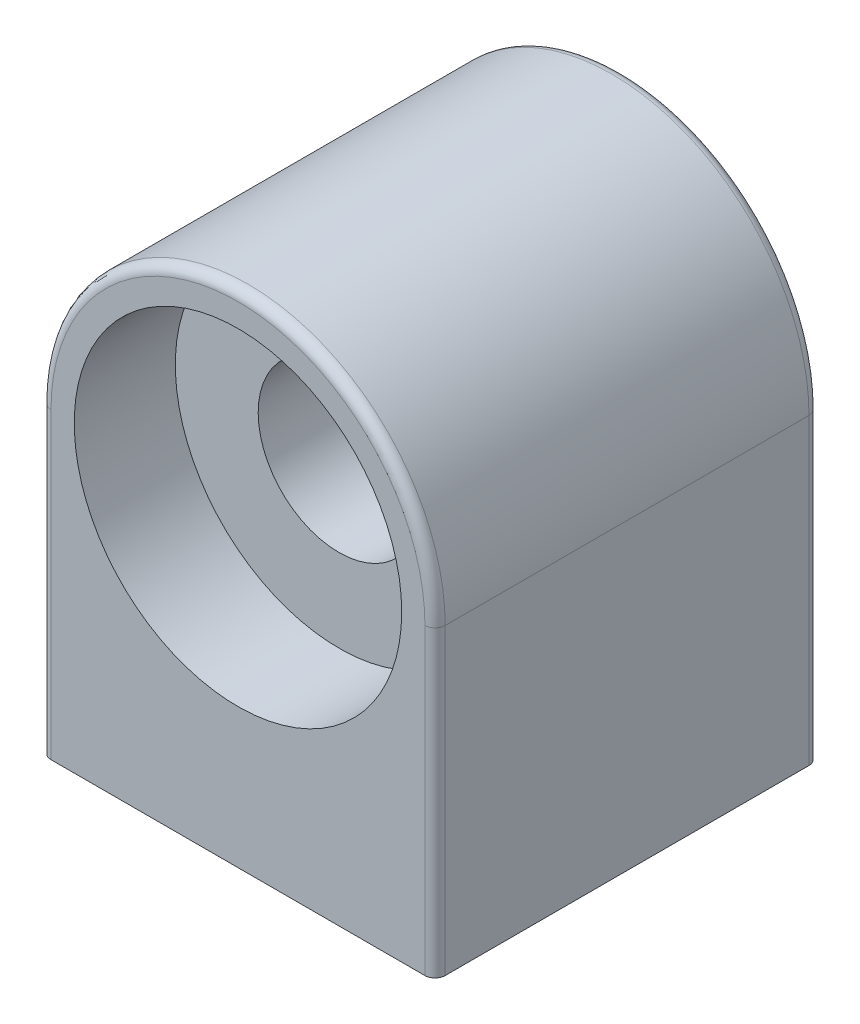
ISO-10303-21;
HEADER;
FILE_DESCRIPTION(('STEP AP214'),'2;1');
FILE_NAME('part.step','',(''),(''),'','','');
FILE_SCHEMA(('AUTOMOTIVE_DESIGN { 1 0 10303 214 1 1 1 1 }'));
ENDSEC;
DATA;
#1=APPLICATION_CONTEXT('core data for automotive mechanical design processes');
#2=APPLICATION_PROTOCOL_DEFINITION('international standard','automotive_design',2000,#1);
#3=PRODUCT_CONTEXT('',#1,'mechanical');
#4=PRODUCT('Part','Part','',(#3));
#5=PRODUCT_RELATED_PRODUCT_CATEGORY('part','',(#4));
#6=PRODUCT_DEFINITION_FORMATION('','',#4);
#7=PRODUCT_DEFINITION_CONTEXT('part definition',#1,'design');
#8=PRODUCT_DEFINITION('design','',#6,#7);
#9=PRODUCT_DEFINITION_SHAPE('','',#8);
#10=(LENGTH_UNIT() NAMED_UNIT(*) SI_UNIT(.MILLI.,.METRE.));
#11=(NAMED_UNIT(*) PLANE_ANGLE_UNIT() SI_UNIT($,.RADIAN.));
#12=(NAMED_UNIT(*) SI_UNIT($,.STERADIAN.) SOLID_ANGLE_UNIT());
#13=UNCERTAINTY_MEASURE_WITH_UNIT(LENGTH_MEASURE(1.E-05),#10,'distance_accuracy_value','');
#14=(GEOMETRIC_REPRESENTATION_CONTEXT(3) GLOBAL_UNCERTAINTY_ASSIGNED_CONTEXT((#13)) GLOBAL_UNIT_ASSIGNED_CONTEXT((#10,
#11,#12)) REPRESENTATION_CONTEXT('',''));
#15=CARTESIAN_POINT('',(0.,0.,0.));
#16=DIRECTION('',(0.,0.,1.));
#17=DIRECTION('',(1.,0.,0.));
#18=AXIS2_PLACEMENT_3D('',#15,#16,#17);
#19=CARTESIAN_POINT('',(0.,0.,9.5));
#20=DIRECTION('',(0.,0.,-1.));
#21=DIRECTION('',(-1.,0.,0.));
#22=AXIS2_PLACEMENT_3D('',#19,#20,#21);
#23=CYLINDRICAL_SURFACE('',#22,4.);
#24=CARTESIAN_POINT('',(0.,0.,-4.5));
#25=DIRECTION('',(0.,0.,-1.));
#26=DIRECTION('',(-1.,0.,0.));
#27=AXIS2_PLACEMENT_3D('',#24,#25,#26);
#28=CIRCLE('',#27,4.);
#29=CARTESIAN_POINT('',(-4.,0.,-4.5));
#30=VERTEX_POINT('',#29);
#31=EDGE_CURVE('E164',#30,#30,#28,.F.);
#32=ORIENTED_EDGE('',*,*,#31,.F.);
#33=EDGE_LOOP('',(#32));
#34=FACE_BOUND('',#33,.T.);
#35=CARTESIAN_POINT('',(0.,0.,4.5));
#36=DIRECTION('',(0.,0.,1.));
#37=DIRECTION('',(1.,0.,0.));
#38=AXIS2_PLACEMENT_3D('',#35,#36,#37);
#39=CIRCLE('',#38,4.);
#40=CARTESIAN_POINT('',(4.,0.,4.5));
#41=VERTEX_POINT('',#40);
#42=EDGE_CURVE('E159',#41,#41,#39,.F.);
#43=ORIENTED_EDGE('',*,*,#42,.F.);
#44=EDGE_LOOP('',(#43));
#45=FACE_BOUND('',#44,.T.);
#46=ADVANCED_FACE('F35',(#34,#45),#23,.F.);
#47=CARTESIAN_POINT('',(0.,0.,9.5));
#48=DIRECTION('',(0.,0.,-1.));
#49=DIRECTION('',(-1.,0.,0.));
#50=AXIS2_PLACEMENT_3D('',#47,#48,#49);
#51=CYLINDRICAL_SURFACE('',#50,9.75);
#52=DIRECTION('',(0.,0.,-1.));
#53=VECTOR('',#52,1.);
#54=CARTESIAN_POINT('',(9.75,0.,9.5));
#55=LINE('',#54,#53);
#56=CARTESIAN_POINT('',(9.75,0.,9.));
#57=VERTEX_POINT('',#56);
#58=CARTESIAN_POINT('',(9.75,0.,-9.));
#59=VERTEX_POINT('',#58);
#60=EDGE_CURVE('E107',#57,#59,#55,.T.);
#61=ORIENTED_EDGE('',*,*,#60,.T.);
#62=CARTESIAN_POINT('',(0.,0.,-9.));
#63=DIRECTION('',(0.,0.,1.));
#64=DIRECTION('',(1.,0.,0.));
#65=AXIS2_PLACEMENT_3D('',#62,#63,#64);
#66=CIRCLE('',#65,9.75);
#67=CARTESIAN_POINT('',(-9.75,0.,-9.));
#68=VERTEX_POINT('',#67);
#69=EDGE_CURVE('E113',#59,#68,#66,.T.);
#70=ORIENTED_EDGE('',*,*,#69,.T.);
#71=DIRECTION('',(0.,0.,-1.));
#72=VECTOR('',#71,1.);
#73=CARTESIAN_POINT('',(-9.75,0.,9.5));
#74=LINE('',#73,#72);
#75=CARTESIAN_POINT('',(-9.75,0.,9.));
#76=VERTEX_POINT('',#75);
#77=EDGE_CURVE('E109',#76,#68,#74,.T.);
#78=ORIENTED_EDGE('',*,*,#77,.F.);
#79=CARTESIAN_POINT('',(0.,0.,9.));
#80=DIRECTION('',(0.,0.,1.));
#81=DIRECTION('',(1.,0.,0.));
#82=AXIS2_PLACEMENT_3D('',#79,#80,#81);
#83=CIRCLE('',#82,9.75);
#84=EDGE_CURVE('E104',#76,#57,#83,.F.);
#85=ORIENTED_EDGE('',*,*,#84,.T.);
#86=EDGE_LOOP('',(#61,#70,#78,#85));
#87=FACE_BOUND('',#86,.T.);
#88=ADVANCED_FACE('F106',(#87),#51,.T.);
#89=CARTESIAN_POINT('',(-9.75,0.,9.5));
#90=DIRECTION('',(1.,0.,0.));
#91=DIRECTION('',(0.,1.,0.));
#92=AXIS2_PLACEMENT_3D('',#89,#90,#91);
#93=PLANE('',#92);
#94=ORIENTED_EDGE('',*,*,#77,.T.);
#95=DIRECTION('',(0.,-1.,0.));
#96=VECTOR('',#95,1.);
#97=CARTESIAN_POINT('',(-9.75,0.,-9.));
#98=LINE('',#97,#96);
#99=CARTESIAN_POINT('',(-9.75,-15.,-9.));
#100=VERTEX_POINT('',#99);
#101=EDGE_CURVE('E11',#68,#100,#98,.T.);
#102=ORIENTED_EDGE('',*,*,#101,.T.);
#103=DIRECTION('',(0.,0.,-1.));
#104=VECTOR('',#103,1.);
#105=CARTESIAN_POINT('',(-9.75,-15.,9.5));
#106=LINE('',#105,#104);
#107=CARTESIAN_POINT('',(-9.75,-15.,9.));
#108=VERTEX_POINT('',#107);
#109=EDGE_CURVE('E170',#108,#100,#106,.T.);
#110=ORIENTED_EDGE('',*,*,#109,.F.);
#111=DIRECTION('',(0.,-1.,0.));
#112=VECTOR('',#111,1.);
#113=CARTESIAN_POINT('',(-9.75,0.,9.));
#114=LINE('',#113,#112);
#115=EDGE_CURVE('E44',#108,#76,#114,.F.);
#116=ORIENTED_EDGE('',*,*,#115,.T.);
#117=EDGE_LOOP('',(#94,#102,#110,#116));
#118=FACE_BOUND('',#117,.T.);
#119=ADVANCED_FACE('F205',(#118),#93,.F.);
#120=CARTESIAN_POINT('',(9.75,-15.,9.5));
#121=DIRECTION('',(0.,1.,0.));
#122=DIRECTION('',(0.,0.,1.));
#123=AXIS2_PLACEMENT_3D('',#120,#121,#122);
#124=PLANE('',#123);
#125=CARTESIAN_POINT('',(0.,-15.,0.));
#126=DIRECTION('',(0.,-1.,0.));
#127=DIRECTION('',(0.,0.,-1.));
#128=AXIS2_PLACEMENT_3D('',#125,#126,#127);
#129=CIRCLE('',#128,2.55);
#130=CARTESIAN_POINT('',(0.,-15.,-2.55));
#131=VERTEX_POINT('',#130);
#132=EDGE_CURVE('E137',#131,#131,#129,.T.);
#133=ORIENTED_EDGE('',*,*,#132,.F.);
#134=EDGE_LOOP('',(#133));
#135=FACE_BOUND('',#134,.T.);
#136=DIRECTION('',(1.,0.,0.));
#137=VECTOR('',#136,1.);
#138=CARTESIAN_POINT('',(9.75,-15.,-9.5));
#139=LINE('',#138,#137);
#140=CARTESIAN_POINT('',(-9.25,-15.,-9.5));
#141=VERTEX_POINT('',#140);
#142=CARTESIAN_POINT('',(9.25,-15.,-9.5));
#143=VERTEX_POINT('',#142);
#144=EDGE_CURVE('E167',#141,#143,#139,.T.);
#145=ORIENTED_EDGE('',*,*,#144,.T.);
#146=CARTESIAN_POINT('',(9.25,-15.,-9.));
#147=DIRECTION('',(0.,1.,0.));
#148=DIRECTION('',(0.,0.,1.));
#149=AXIS2_PLACEMENT_3D('',#146,#147,#148);
#150=CIRCLE('',#149,0.5);
#151=CARTESIAN_POINT('',(9.75,-15.,-9.));
#152=VERTEX_POINT('',#151);
#153=EDGE_CURVE('E114',#143,#152,#150,.F.);
#154=ORIENTED_EDGE('',*,*,#153,.T.);
#155=DIRECTION('',(0.,0.,-1.));
#156=VECTOR('',#155,1.);
#157=CARTESIAN_POINT('',(9.75,-15.,9.5));
#158=LINE('',#157,#156);
#159=CARTESIAN_POINT('',(9.75,-15.,9.));
#160=VERTEX_POINT('',#159);
#161=EDGE_CURVE('E124',#160,#152,#158,.T.);
#162=ORIENTED_EDGE('',*,*,#161,.F.);
#163=CARTESIAN_POINT('',(9.25,-15.,9.));
#164=DIRECTION('',(0.,1.,0.));
#165=DIRECTION('',(0.,0.,1.));
#166=AXIS2_PLACEMENT_3D('',#163,#164,#165);
#167=CIRCLE('',#166,0.5);
#168=CARTESIAN_POINT('',(9.25,-15.,9.5));
#169=VERTEX_POINT('',#168);
#170=EDGE_CURVE('E129',#160,#169,#167,.F.);
#171=ORIENTED_EDGE('',*,*,#170,.T.);
#172=DIRECTION('',(1.,0.,0.));
#173=VECTOR('',#172,1.);
#174=CARTESIAN_POINT('',(9.75,-15.,9.5));
#175=LINE('',#174,#173);
#176=CARTESIAN_POINT('',(-9.25,-15.,9.5));
#177=VERTEX_POINT('',#176);
#178=EDGE_CURVE('E125',#177,#169,#175,.T.);
#179=ORIENTED_EDGE('',*,*,#178,.F.);
#180=CARTESIAN_POINT('',(-9.25,-15.,9.));
#181=DIRECTION('',(0.,1.,0.));
#182=DIRECTION('',(0.,0.,1.));
#183=AXIS2_PLACEMENT_3D('',#180,#181,#182);
#184=CIRCLE('',#183,0.5);
#185=EDGE_CURVE('E150',#177,#108,#184,.F.);
#186=ORIENTED_EDGE('',*,*,#185,.T.);
#187=ORIENTED_EDGE('',*,*,#109,.T.);
#188=CARTESIAN_POINT('',(-9.25,-15.,-9.));
#189=DIRECTION('',(0.,1.,0.));
#190=DIRECTION('',(0.,0.,1.));
#191=AXIS2_PLACEMENT_3D('',#188,#189,#190);
#192=CIRCLE('',#191,0.5);
#193=EDGE_CURVE('E148',#100,#141,#192,.F.);
#194=ORIENTED_EDGE('',*,*,#193,.T.);
#195=EDGE_LOOP('',(#145,#154,#162,#171,#179,#186,#187,#194));
#196=FACE_BOUND('',#195,.T.);
#197=ADVANCED_FACE('F202',(#135,#196),#124,.F.);
#198=CARTESIAN_POINT('',(9.75,0.,9.5));
#199=DIRECTION('',(-1.,0.,0.));
#200=DIRECTION('',(0.,-1.,0.));
#201=AXIS2_PLACEMENT_3D('',#198,#199,#200);
#202=PLANE('',#201);
#203=ORIENTED_EDGE('',*,*,#161,.T.);
#204=DIRECTION('',(0.,1.,0.));
#205=VECTOR('',#204,1.);
#206=CARTESIAN_POINT('',(9.75,0.,-9.));
#207=LINE('',#206,#205);
#208=EDGE_CURVE('E123',#152,#59,#207,.T.);
#209=ORIENTED_EDGE('',*,*,#208,.T.);
#210=ORIENTED_EDGE('',*,*,#60,.F.);
#211=DIRECTION('',(0.,1.,0.));
#212=VECTOR('',#211,1.);
#213=CARTESIAN_POINT('',(9.75,-15.,9.));
#214=LINE('',#213,#212);
#215=EDGE_CURVE('E120',#57,#160,#214,.F.);
#216=ORIENTED_EDGE('',*,*,#215,.T.);
#217=EDGE_LOOP('',(#203,#209,#210,#216));
#218=FACE_BOUND('',#217,.T.);
#219=ADVANCED_FACE('F119',(#218),#202,.F.);
#220=CARTESIAN_POINT('',(0.,0.,9.5));
#221=DIRECTION('',(0.,0.,1.));
#222=DIRECTION('',(1.,0.,0.));
#223=AXIS2_PLACEMENT_3D('',#220,#221,#222);
#224=PLANE('',#223);
#225=CARTESIAN_POINT('',(0.,0.,9.5));
#226=DIRECTION('',(0.,0.,1.));
#227=DIRECTION('',(1.,0.,0.));
#228=AXIS2_PLACEMENT_3D('',#225,#226,#227);
#229=CIRCLE('',#228,8.1);
#230=CARTESIAN_POINT('',(8.1,0.,9.5));
#231=VERTEX_POINT('',#230);
#232=EDGE_CURVE('E182',#231,#231,#229,.T.);
#233=ORIENTED_EDGE('',*,*,#232,.F.);
#234=EDGE_LOOP('',(#233));
#235=FACE_BOUND('',#234,.T.);
#236=ORIENTED_EDGE('',*,*,#178,.T.);
#237=DIRECTION('',(0.,1.,0.));
#238=VECTOR('',#237,1.);
#239=CARTESIAN_POINT('',(9.25,0.,9.5));
#240=LINE('',#239,#238);
#241=CARTESIAN_POINT('',(9.25,0.,9.5));
#242=VERTEX_POINT('',#241);
#243=EDGE_CURVE('E140',#169,#242,#240,.T.);
#244=ORIENTED_EDGE('',*,*,#243,.T.);
#245=CARTESIAN_POINT('',(0.,0.,9.5));
#246=DIRECTION('',(0.,0.,1.));
#247=DIRECTION('',(1.,0.,0.));
#248=AXIS2_PLACEMENT_3D('',#245,#246,#247);
#249=CIRCLE('',#248,9.25);
#250=CARTESIAN_POINT('',(-9.25,0.,9.5));
#251=VERTEX_POINT('',#250);
#252=EDGE_CURVE('E59',#242,#251,#249,.T.);
#253=ORIENTED_EDGE('',*,*,#252,.T.);
#254=DIRECTION('',(0.,-1.,0.));
#255=VECTOR('',#254,1.);
#256=CARTESIAN_POINT('',(-9.25,-15.,9.5));
#257=LINE('',#256,#255);
#258=EDGE_CURVE('E143',#251,#177,#257,.T.);
#259=ORIENTED_EDGE('',*,*,#258,.T.);
#260=EDGE_LOOP('',(#236,#244,#253,#259));
#261=FACE_BOUND('',#260,.T.);
#262=ADVANCED_FACE('F230',(#235,#261),#224,.T.);
#263=CARTESIAN_POINT('',(0.,0.,-9.5));
#264=DIRECTION('',(0.,0.,1.));
#265=DIRECTION('',(1.,0.,0.));
#266=AXIS2_PLACEMENT_3D('',#263,#264,#265);
#267=PLANE('',#266);
#268=CARTESIAN_POINT('',(0.,0.,-9.5));
#269=DIRECTION('',(0.,0.,-1.));
#270=DIRECTION('',(-1.,0.,0.));
#271=AXIS2_PLACEMENT_3D('',#268,#269,#270);
#272=CIRCLE('',#271,8.1);
#273=CARTESIAN_POINT('',(-8.1,0.,-9.5));
#274=VERTEX_POINT('',#273);
#275=EDGE_CURVE('E162',#274,#274,#272,.T.);
#276=ORIENTED_EDGE('',*,*,#275,.F.);
#277=EDGE_LOOP('',(#276));
#278=FACE_BOUND('',#277,.T.);
#279=CARTESIAN_POINT('',(0.,0.,-9.5));
#280=DIRECTION('',(0.,0.,1.));
#281=DIRECTION('',(1.,0.,0.));
#282=AXIS2_PLACEMENT_3D('',#279,#280,#281);
#283=CIRCLE('',#282,9.25);
#284=CARTESIAN_POINT('',(-9.25,0.,-9.5));
#285=VERTEX_POINT('',#284);
#286=CARTESIAN_POINT('',(9.25,0.,-9.5));
#287=VERTEX_POINT('',#286);
#288=EDGE_CURVE('E154',#285,#287,#283,.F.);
#289=ORIENTED_EDGE('',*,*,#288,.T.);
#290=DIRECTION('',(0.,1.,0.));
#291=VECTOR('',#290,1.);
#292=CARTESIAN_POINT('',(9.25,0.,-9.5));
#293=LINE('',#292,#291);
#294=EDGE_CURVE('E152',#287,#143,#293,.F.);
#295=ORIENTED_EDGE('',*,*,#294,.T.);
#296=ORIENTED_EDGE('',*,*,#144,.F.);
#297=DIRECTION('',(0.,-1.,0.));
#298=VECTOR('',#297,1.);
#299=CARTESIAN_POINT('',(-9.25,0.,-9.5));
#300=LINE('',#299,#298);
#301=EDGE_CURVE('E156',#141,#285,#300,.F.);
#302=ORIENTED_EDGE('',*,*,#301,.T.);
#303=EDGE_LOOP('',(#289,#295,#296,#302));
#304=FACE_BOUND('',#303,.T.);
#305=ADVANCED_FACE('F227',(#278,#304),#267,.F.);
#306=CARTESIAN_POINT('',(0.,0.,-4.5));
#307=DIRECTION('',(0.,0.,-1.));
#308=DIRECTION('',(-1.,0.,0.));
#309=AXIS2_PLACEMENT_3D('',#306,#307,#308);
#310=PLANE('',#309);
#311=CARTESIAN_POINT('',(0.,0.,-4.5));
#312=DIRECTION('',(0.,0.,-1.));
#313=DIRECTION('',(-1.,0.,0.));
#314=AXIS2_PLACEMENT_3D('',#311,#312,#313);
#315=CIRCLE('',#314,8.1);
#316=CARTESIAN_POINT('',(-8.1,0.,-4.5));
#317=VERTEX_POINT('',#316);
#318=EDGE_CURVE('E168',#317,#317,#315,.T.);
#319=ORIENTED_EDGE('',*,*,#318,.T.);
#320=EDGE_LOOP('',(#319));
#321=FACE_BOUND('',#320,.T.);
#322=ORIENTED_EDGE('',*,*,#31,.T.);
#323=EDGE_LOOP('',(#322));
#324=FACE_BOUND('',#323,.T.);
#325=ADVANCED_FACE('F229',(#321,#324),#310,.T.);
#326=CARTESIAN_POINT('',(0.,0.,-4.5));
#327=DIRECTION('',(0.,0.,-1.));
#328=DIRECTION('',(-1.,0.,0.));
#329=AXIS2_PLACEMENT_3D('',#326,#327,#328);
#330=CYLINDRICAL_SURFACE('',#329,8.1);
#331=ORIENTED_EDGE('',*,*,#318,.F.);
#332=EDGE_LOOP('',(#331));
#333=FACE_BOUND('',#332,.T.);
#334=ORIENTED_EDGE('',*,*,#275,.T.);
#335=EDGE_LOOP('',(#334));
#336=FACE_BOUND('',#335,.T.);
#337=ADVANCED_FACE('F237',(#333,#336),#330,.F.);
#338=CARTESIAN_POINT('',(0.,0.,4.5));
#339=DIRECTION('',(0.,0.,1.));
#340=DIRECTION('',(1.,0.,0.));
#341=AXIS2_PLACEMENT_3D('',#338,#339,#340);
#342=PLANE('',#341);
#343=CARTESIAN_POINT('',(0.,0.,4.5));
#344=DIRECTION('',(0.,0.,1.));
#345=DIRECTION('',(1.,0.,0.));
#346=AXIS2_PLACEMENT_3D('',#343,#344,#345);
#347=CIRCLE('',#346,8.1);
#348=CARTESIAN_POINT('',(8.1,0.,4.5));
#349=VERTEX_POINT('',#348);
#350=EDGE_CURVE('E163',#349,#349,#347,.T.);
#351=ORIENTED_EDGE('',*,*,#350,.T.);
#352=EDGE_LOOP('',(#351));
#353=FACE_BOUND('',#352,.T.);
#354=ORIENTED_EDGE('',*,*,#42,.T.);
#355=EDGE_LOOP('',(#354));
#356=FACE_BOUND('',#355,.T.);
#357=ADVANCED_FACE('F255',(#353,#356),#342,.T.);
#358=CARTESIAN_POINT('',(0.,0.,4.5));
#359=DIRECTION('',(0.,0.,1.));
#360=DIRECTION('',(1.,0.,0.));
#361=AXIS2_PLACEMENT_3D('',#358,#359,#360);
#362=CYLINDRICAL_SURFACE('',#361,8.1);
#363=ORIENTED_EDGE('',*,*,#350,.F.);
#364=EDGE_LOOP('',(#363));
#365=FACE_BOUND('',#364,.T.);
#366=ORIENTED_EDGE('',*,*,#232,.T.);
#367=EDGE_LOOP('',(#366));
#368=FACE_BOUND('',#367,.T.);
#369=ADVANCED_FACE('F198',(#365,#368),#362,.F.);
#370=CARTESIAN_POINT('',(0.,-7.,0.));
#371=DIRECTION('',(0.,-1.,0.));
#372=DIRECTION('',(0.,0.,-1.));
#373=AXIS2_PLACEMENT_3D('',#370,#371,#372);
#374=CYLINDRICAL_SURFACE('',#373,2.55);
#375=CARTESIAN_POINT('',(0.,-7.,0.));
#376=DIRECTION('',(0.,-1.,0.));
#377=DIRECTION('',(0.,0.,-1.));
#378=AXIS2_PLACEMENT_3D('',#375,#376,#377);
#379=CIRCLE('',#378,2.55);
#380=CARTESIAN_POINT('',(0.,-7.,-2.55));
#381=VERTEX_POINT('',#380);
#382=EDGE_CURVE('E185',#381,#381,#379,.T.);
#383=ORIENTED_EDGE('',*,*,#382,.F.);
#384=EDGE_LOOP('',(#383));
#385=FACE_BOUND('',#384,.T.);
#386=ORIENTED_EDGE('',*,*,#132,.T.);
#387=EDGE_LOOP('',(#386));
#388=FACE_BOUND('',#387,.T.);
#389=ADVANCED_FACE('F195',(#385,#388),#374,.F.);
#390=CARTESIAN_POINT('',(0.,-7.,0.));
#391=DIRECTION('',(0.,-1.,0.));
#392=DIRECTION('',(0.,0.,-1.));
#393=AXIS2_PLACEMENT_3D('',#390,#391,#392);
#394=PLANE('',#393);
#395=ORIENTED_EDGE('',*,*,#382,.T.);
#396=EDGE_LOOP('',(#395));
#397=FACE_BOUND('',#396,.T.);
#398=ADVANCED_FACE('F193',(#397),#394,.T.);
#399=CARTESIAN_POINT('',(-9.25,0.,-9.));
#400=DIRECTION('',(0.,-1.,0.));
#401=DIRECTION('',(1.,0.,0.));
#402=AXIS2_PLACEMENT_3D('',#399,#400,#401);
#403=CYLINDRICAL_SURFACE('',#402,0.5);
#404=ORIENTED_EDGE('',*,*,#193,.F.);
#405=ORIENTED_EDGE('',*,*,#101,.F.);
#406=CARTESIAN_POINT('',(-9.25,0.,-9.));
#407=DIRECTION('',(0.,1.,0.));
#408=DIRECTION('',(0.,0.,1.));
#409=AXIS2_PLACEMENT_3D('',#406,#407,#408);
#410=CIRCLE('',#409,0.5);
#411=EDGE_CURVE('E134',#285,#68,#410,.T.);
#412=ORIENTED_EDGE('',*,*,#411,.F.);
#413=ORIENTED_EDGE('',*,*,#301,.F.);
#414=EDGE_LOOP('',(#404,#405,#412,#413));
#415=FACE_BOUND('',#414,.T.);
#416=ADVANCED_FACE('F226',(#415),#403,.T.);
#417=CARTESIAN_POINT('',(0.,0.,-9.));
#418=DIRECTION('',(0.,0.,1.));
#419=DIRECTION('',(1.,0.,0.));
#420=AXIS2_PLACEMENT_3D('',#417,#418,#419);
#421=TOROIDAL_SURFACE('',#420,9.25,0.5);
#422=ORIENTED_EDGE('',*,*,#411,.T.);
#423=ORIENTED_EDGE('',*,*,#69,.F.);
#424=CARTESIAN_POINT('',(9.25,0.,-9.));
#425=DIRECTION('',(0.,-1.,0.));
#426=DIRECTION('',(1.,0.,0.));
#427=AXIS2_PLACEMENT_3D('',#424,#425,#426);
#428=CIRCLE('',#427,0.5);
#429=EDGE_CURVE('E132',#287,#59,#428,.T.);
#430=ORIENTED_EDGE('',*,*,#429,.F.);
#431=ORIENTED_EDGE('',*,*,#288,.F.);
#432=EDGE_LOOP('',(#422,#423,#430,#431));
#433=FACE_BOUND('',#432,.T.);
#434=ADVANCED_FACE('F219',(#433),#421,.T.);
#435=CARTESIAN_POINT('',(9.25,0.,-9.));
#436=DIRECTION('',(0.,1.,0.));
#437=DIRECTION('',(-1.,0.,0.));
#438=AXIS2_PLACEMENT_3D('',#435,#436,#437);
#439=CYLINDRICAL_SURFACE('',#438,0.5);
#440=ORIENTED_EDGE('',*,*,#153,.F.);
#441=ORIENTED_EDGE('',*,*,#294,.F.);
#442=ORIENTED_EDGE('',*,*,#429,.T.);
#443=ORIENTED_EDGE('',*,*,#208,.F.);
#444=EDGE_LOOP('',(#440,#441,#442,#443));
#445=FACE_BOUND('',#444,.T.);
#446=ADVANCED_FACE('F214',(#445),#439,.T.);
#447=CARTESIAN_POINT('',(-9.25,0.,9.));
#448=DIRECTION('',(0.,1.,0.));
#449=DIRECTION('',(-1.,0.,0.));
#450=AXIS2_PLACEMENT_3D('',#447,#448,#449);
#451=CYLINDRICAL_SURFACE('',#450,0.5);
#452=ORIENTED_EDGE('',*,*,#185,.F.);
#453=ORIENTED_EDGE('',*,*,#258,.F.);
#454=CARTESIAN_POINT('',(-9.25,0.,9.));
#455=DIRECTION('',(0.,1.,0.));
#456=DIRECTION('',(0.,0.,1.));
#457=AXIS2_PLACEMENT_3D('',#454,#455,#456);
#458=CIRCLE('',#457,0.5);
#459=EDGE_CURVE('E39',#76,#251,#458,.T.);
#460=ORIENTED_EDGE('',*,*,#459,.F.);
#461=ORIENTED_EDGE('',*,*,#115,.F.);
#462=EDGE_LOOP('',(#452,#453,#460,#461));
#463=FACE_BOUND('',#462,.T.);
#464=ADVANCED_FACE('F37',(#463),#451,.T.);
#465=CARTESIAN_POINT('',(0.,0.,9.));
#466=DIRECTION('',(0.,0.,1.));
#467=DIRECTION('',(1.,0.,0.));
#468=AXIS2_PLACEMENT_3D('',#465,#466,#467);
#469=TOROIDAL_SURFACE('',#468,9.25,0.5);
#470=ORIENTED_EDGE('',*,*,#459,.T.);
#471=ORIENTED_EDGE('',*,*,#252,.F.);
#472=CARTESIAN_POINT('',(9.25,0.,9.));
#473=DIRECTION('',(0.,-1.,0.));
#474=DIRECTION('',(0.,0.,-1.));
#475=AXIS2_PLACEMENT_3D('',#472,#473,#474);
#476=CIRCLE('',#475,0.5);
#477=EDGE_CURVE('E52',#57,#242,#476,.T.);
#478=ORIENTED_EDGE('',*,*,#477,.F.);
#479=ORIENTED_EDGE('',*,*,#84,.F.);
#480=EDGE_LOOP('',(#470,#471,#478,#479));
#481=FACE_BOUND('',#480,.T.);
#482=ADVANCED_FACE('F131',(#481),#469,.T.);
#483=CARTESIAN_POINT('',(9.25,0.,9.));
#484=DIRECTION('',(0.,-1.,0.));
#485=DIRECTION('',(1.,0.,0.));
#486=AXIS2_PLACEMENT_3D('',#483,#484,#485);
#487=CYLINDRICAL_SURFACE('',#486,0.5);
#488=ORIENTED_EDGE('',*,*,#170,.F.);
#489=ORIENTED_EDGE('',*,*,#215,.F.);
#490=ORIENTED_EDGE('',*,*,#477,.T.);
#491=ORIENTED_EDGE('',*,*,#243,.F.);
#492=EDGE_LOOP('',(#488,#489,#490,#491));
#493=FACE_BOUND('',#492,.T.);
#494=ADVANCED_FACE('F128',(#493),#487,.T.);
#495=CLOSED_SHELL('',(#46,#88,#119,#197,#219,#262,#305,#325,#337,#357,#369,#389,#398,#416,#434,
#446,#464,#482,#494));
#496=MANIFOLD_SOLID_BREP('B2',#495);
#497=ADVANCED_BREP_SHAPE_REPRESENTATION('',(#18,#496),#14);
#498=SHAPE_DEFINITION_REPRESENTATION(#9,#497);
ENDSEC;
END-ISO-10303-21;
